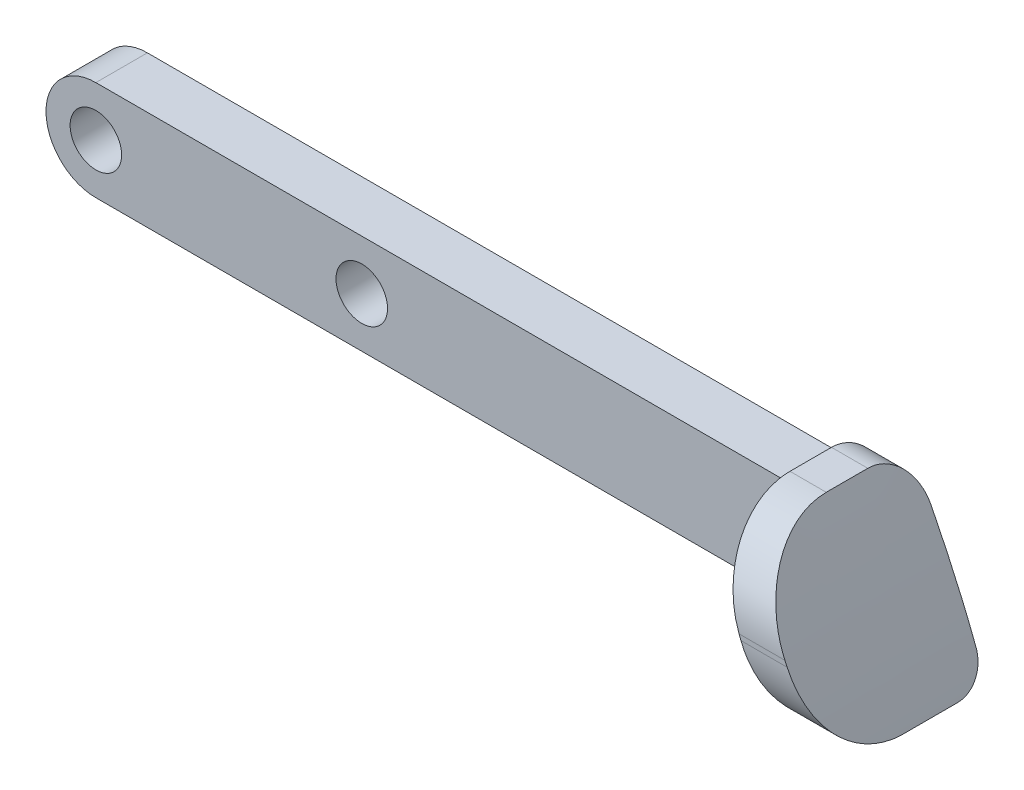
ISO-10303-21;
HEADER;
FILE_DESCRIPTION(('STEP AP214'),'2;1');
FILE_NAME('part.step','',(''),(''),'','','');
FILE_SCHEMA(('AUTOMOTIVE_DESIGN { 1 0 10303 214 1 1 1 1 }'));
ENDSEC;
DATA;
#1=APPLICATION_CONTEXT('core data for automotive mechanical design processes');
#2=APPLICATION_PROTOCOL_DEFINITION('international standard','automotive_design',2000,#1);
#3=PRODUCT_CONTEXT('',#1,'mechanical');
#4=PRODUCT('Part','Part','',(#3));
#5=PRODUCT_RELATED_PRODUCT_CATEGORY('part','',(#4));
#6=PRODUCT_DEFINITION_FORMATION('','',#4);
#7=PRODUCT_DEFINITION_CONTEXT('part definition',#1,'design');
#8=PRODUCT_DEFINITION('design','',#6,#7);
#9=PRODUCT_DEFINITION_SHAPE('','',#8);
#10=(LENGTH_UNIT() NAMED_UNIT(*) SI_UNIT(.MILLI.,.METRE.));
#11=(NAMED_UNIT(*) PLANE_ANGLE_UNIT() SI_UNIT($,.RADIAN.));
#12=(NAMED_UNIT(*) SI_UNIT($,.STERADIAN.) SOLID_ANGLE_UNIT());
#13=UNCERTAINTY_MEASURE_WITH_UNIT(LENGTH_MEASURE(1.E-05),#10,'distance_accuracy_value','');
#14=(GEOMETRIC_REPRESENTATION_CONTEXT(3) GLOBAL_UNCERTAINTY_ASSIGNED_CONTEXT((#13)) GLOBAL_UNIT_ASSIGNED_CONTEXT((#10,
#11,#12)) REPRESENTATION_CONTEXT('',''));
#15=CARTESIAN_POINT('',(0.,0.,0.));
#16=DIRECTION('',(0.,0.,1.));
#17=DIRECTION('',(1.,0.,0.));
#18=AXIS2_PLACEMENT_3D('',#15,#16,#17);
#19=CARTESIAN_POINT('',(0.,3.,3.1));
#20=DIRECTION('',(0.,1.,0.));
#21=DIRECTION('',(0.,0.,1.));
#22=AXIS2_PLACEMENT_3D('',#19,#20,#21);
#23=PLANE('',#22);
#24=DIRECTION('',(0.,0.,1.));
#25=VECTOR('',#24,1.);
#26=CARTESIAN_POINT('',(44.6395584776889,3.,3.1));
#27=LINE('',#26,#25);
#28=CARTESIAN_POINT('',(44.6395584776889,3.,0.));
#29=VERTEX_POINT('',#28);
#30=CARTESIAN_POINT('',(44.6395584776889,3.,3.1));
#31=VERTEX_POINT('',#30);
#32=EDGE_CURVE('E152',#29,#31,#27,.T.);
#33=ORIENTED_EDGE('',*,*,#32,.F.);
#34=DIRECTION('',(1.,0.,0.));
#35=VECTOR('',#34,1.);
#36=CARTESIAN_POINT('',(0.,3.,0.));
#37=LINE('',#36,#35);
#38=CARTESIAN_POINT('',(0.,3.,0.));
#39=VERTEX_POINT('',#38);
#40=EDGE_CURVE('E164',#39,#29,#37,.T.);
#41=ORIENTED_EDGE('',*,*,#40,.F.);
#42=DIRECTION('',(0.,0.,-1.));
#43=VECTOR('',#42,1.);
#44=CARTESIAN_POINT('',(0.,3.,3.1));
#45=LINE('',#44,#43);
#46=CARTESIAN_POINT('',(0.,3.,3.1));
#47=VERTEX_POINT('',#46);
#48=EDGE_CURVE('E169',#47,#39,#45,.T.);
#49=ORIENTED_EDGE('',*,*,#48,.F.);
#50=DIRECTION('',(1.,0.,0.));
#51=VECTOR('',#50,1.);
#52=CARTESIAN_POINT('',(0.,3.,3.1));
#53=LINE('',#52,#51);
#54=EDGE_CURVE('E285',#47,#31,#53,.T.);
#55=ORIENTED_EDGE('',*,*,#54,.T.);
#56=EDGE_LOOP('',(#33,#41,#49,#55));
#57=FACE_BOUND('',#56,.T.);
#58=ADVANCED_FACE('F38',(#57),#23,.T.);
#59=CARTESIAN_POINT('',(0.,0.,3.1));
#60=DIRECTION('',(0.,0.,-1.));
#61=DIRECTION('',(-1.,0.,0.));
#62=AXIS2_PLACEMENT_3D('',#59,#60,#61);
#63=CYLINDRICAL_SURFACE('',#62,3.);
#64=CARTESIAN_POINT('',(0.,0.,0.));
#65=DIRECTION('',(0.,0.,1.));
#66=DIRECTION('',(1.,0.,0.));
#67=AXIS2_PLACEMENT_3D('',#64,#65,#66);
#68=CIRCLE('',#67,3.);
#69=CARTESIAN_POINT('',(0.,-3.,0.));
#70=VERTEX_POINT('',#69);
#71=EDGE_CURVE('E159',#39,#70,#68,.T.);
#72=ORIENTED_EDGE('',*,*,#71,.T.);
#73=DIRECTION('',(0.,0.,-1.));
#74=VECTOR('',#73,1.);
#75=CARTESIAN_POINT('',(0.,-3.,3.1));
#76=LINE('',#75,#74);
#77=CARTESIAN_POINT('',(0.,-3.,3.1));
#78=VERTEX_POINT('',#77);
#79=EDGE_CURVE('E156',#78,#70,#76,.T.);
#80=ORIENTED_EDGE('',*,*,#79,.F.);
#81=CARTESIAN_POINT('',(0.,0.,3.1));
#82=DIRECTION('',(0.,0.,1.));
#83=DIRECTION('',(1.,0.,0.));
#84=AXIS2_PLACEMENT_3D('',#81,#82,#83);
#85=CIRCLE('',#84,3.);
#86=EDGE_CURVE('E288',#47,#78,#85,.T.);
#87=ORIENTED_EDGE('',*,*,#86,.F.);
#88=ORIENTED_EDGE('',*,*,#48,.T.);
#89=EDGE_LOOP('',(#72,#80,#87,#88));
#90=FACE_BOUND('',#89,.T.);
#91=ADVANCED_FACE('F310',(#90),#63,.T.);
#92=CARTESIAN_POINT('',(0.,-3.,3.1));
#93=DIRECTION('',(0.,1.,0.));
#94=DIRECTION('',(0.,0.,1.));
#95=AXIS2_PLACEMENT_3D('',#92,#93,#94);
#96=PLANE('',#95);
#97=DIRECTION('',(1.,0.,0.));
#98=VECTOR('',#97,1.);
#99=CARTESIAN_POINT('',(0.,-3.,0.));
#100=LINE('',#99,#98);
#101=CARTESIAN_POINT('',(46.9652062875649,-3.,0.));
#102=VERTEX_POINT('',#101);
#103=EDGE_CURVE('E138',#70,#102,#100,.T.);
#104=ORIENTED_EDGE('',*,*,#103,.T.);
#105=DIRECTION('',(0.,0.,1.));
#106=VECTOR('',#105,1.);
#107=CARTESIAN_POINT('',(46.9652062875649,-3.,3.1));
#108=LINE('',#107,#106);
#109=CARTESIAN_POINT('',(46.9652062875649,-3.,3.1));
#110=VERTEX_POINT('',#109);
#111=EDGE_CURVE('E146',#102,#110,#108,.T.);
#112=ORIENTED_EDGE('',*,*,#111,.T.);
#113=DIRECTION('',(1.,0.,0.));
#114=VECTOR('',#113,1.);
#115=CARTESIAN_POINT('',(0.,-3.,3.1));
#116=LINE('',#115,#114);
#117=EDGE_CURVE('E170',#78,#110,#116,.T.);
#118=ORIENTED_EDGE('',*,*,#117,.F.);
#119=ORIENTED_EDGE('',*,*,#79,.T.);
#120=EDGE_LOOP('',(#104,#112,#118,#119));
#121=FACE_BOUND('',#120,.T.);
#122=ADVANCED_FACE('F154',(#121),#96,.F.);
#123=CARTESIAN_POINT('',(0.,0.,3.1));
#124=DIRECTION('',(0.,0.,-1.));
#125=DIRECTION('',(-1.,0.,0.));
#126=AXIS2_PLACEMENT_3D('',#123,#124,#125);
#127=CYLINDRICAL_SURFACE('',#126,1.55);
#128=CARTESIAN_POINT('',(0.,0.,3.1));
#129=DIRECTION('',(0.,0.,1.));
#130=DIRECTION('',(1.,0.,0.));
#131=AXIS2_PLACEMENT_3D('',#128,#129,#130);
#132=CIRCLE('',#131,1.55);
#133=CARTESIAN_POINT('',(-1.55,0.,3.1));
#134=VERTEX_POINT('',#133);
#135=EDGE_CURVE('E162',#134,#134,#132,.T.);
#136=CARTESIAN_POINT('',(0.,0.,0.));
#137=DIRECTION('',(0.,0.,1.));
#138=DIRECTION('',(1.,0.,0.));
#139=AXIS2_PLACEMENT_3D('',#136,#137,#138);
#140=CIRCLE('',#139,1.55);
#141=CARTESIAN_POINT('',(-1.55,0.,0.));
#142=VERTEX_POINT('',#141);
#143=EDGE_CURVE('E294',#142,#142,#140,.T.);
#144=CARTESIAN_POINT('',(-1.55,0.,3.1));
#145=CARTESIAN_POINT('',(-1.55,0.,3.06770833333333));
#146=CARTESIAN_POINT('',(-1.55,0.,3.03541666666667));
#147=CARTESIAN_POINT('',(-1.55,0.,2.97083333333333));
#148=CARTESIAN_POINT('',(-1.55,0.,2.93854166666667));
#149=CARTESIAN_POINT('',(-1.55,0.,2.87395833333333));
#150=CARTESIAN_POINT('',(-1.55,0.,2.84166666666667));
#151=CARTESIAN_POINT('',(-1.55,0.,2.77708333333333));
#152=CARTESIAN_POINT('',(-1.55,0.,2.74479166666667));
#153=CARTESIAN_POINT('',(-1.55,0.,2.68020833333333));
#154=CARTESIAN_POINT('',(-1.55,0.,2.64791666666667));
#155=CARTESIAN_POINT('',(-1.55,0.,2.58333333333333));
#156=CARTESIAN_POINT('',(-1.55,0.,2.55104166666667));
#157=CARTESIAN_POINT('',(-1.55,0.,2.48645833333333));
#158=CARTESIAN_POINT('',(-1.55,0.,2.45416666666667));
#159=CARTESIAN_POINT('',(-1.55,0.,2.38958333333333));
#160=CARTESIAN_POINT('',(-1.55,0.,2.35729166666667));
#161=CARTESIAN_POINT('',(-1.55,0.,2.29270833333333));
#162=CARTESIAN_POINT('',(-1.55,0.,2.26041666666667));
#163=CARTESIAN_POINT('',(-1.55,0.,2.19583333333333));
#164=CARTESIAN_POINT('',(-1.55,0.,2.16354166666667));
#165=CARTESIAN_POINT('',(-1.55,0.,2.09895833333333));
#166=CARTESIAN_POINT('',(-1.55,0.,2.06666666666667));
#167=CARTESIAN_POINT('',(-1.55,0.,2.00208333333333));
#168=CARTESIAN_POINT('',(-1.55,0.,1.96979166666667));
#169=CARTESIAN_POINT('',(-1.55,0.,1.90520833333333));
#170=CARTESIAN_POINT('',(-1.55,0.,1.87291666666667));
#171=CARTESIAN_POINT('',(-1.55,0.,1.80833333333333));
#172=CARTESIAN_POINT('',(-1.55,0.,1.77604166666667));
#173=CARTESIAN_POINT('',(-1.55,0.,1.71145833333333));
#174=CARTESIAN_POINT('',(-1.55,0.,1.67916666666667));
#175=CARTESIAN_POINT('',(-1.55,0.,1.61458333333333));
#176=CARTESIAN_POINT('',(-1.55,0.,1.58229166666667));
#177=CARTESIAN_POINT('',(-1.55,0.,1.51770833333333));
#178=CARTESIAN_POINT('',(-1.55,0.,1.48541666666667));
#179=CARTESIAN_POINT('',(-1.55,0.,1.42083333333333));
#180=CARTESIAN_POINT('',(-1.55,0.,1.38854166666667));
#181=CARTESIAN_POINT('',(-1.55,0.,1.32395833333333));
#182=CARTESIAN_POINT('',(-1.55,0.,1.29166666666667));
#183=CARTESIAN_POINT('',(-1.55,0.,1.22708333333333));
#184=CARTESIAN_POINT('',(-1.55,0.,1.19479166666667));
#185=CARTESIAN_POINT('',(-1.55,0.,1.13020833333333));
#186=CARTESIAN_POINT('',(-1.55,0.,1.09791666666667));
#187=CARTESIAN_POINT('',(-1.55,0.,1.03333333333333));
#188=CARTESIAN_POINT('',(-1.55,0.,1.00104166666667));
#189=CARTESIAN_POINT('',(-1.55,0.,0.936458333333333));
#190=CARTESIAN_POINT('',(-1.55,0.,0.904166666666667));
#191=CARTESIAN_POINT('',(-1.55,0.,0.839583333333334));
#192=CARTESIAN_POINT('',(-1.55,0.,0.807291666666667));
#193=CARTESIAN_POINT('',(-1.55,0.,0.742708333333333));
#194=CARTESIAN_POINT('',(-1.55,0.,0.710416666666667));
#195=CARTESIAN_POINT('',(-1.55,0.,0.645833333333333));
#196=CARTESIAN_POINT('',(-1.55,0.,0.613541666666667));
#197=CARTESIAN_POINT('',(-1.55,0.,0.548958333333333));
#198=CARTESIAN_POINT('',(-1.55,0.,0.516666666666667));
#199=CARTESIAN_POINT('',(-1.55,0.,0.452083333333333));
#200=CARTESIAN_POINT('',(-1.55,0.,0.419791666666667));
#201=CARTESIAN_POINT('',(-1.55,0.,0.355208333333333));
#202=CARTESIAN_POINT('',(-1.55,0.,0.322916666666667));
#203=CARTESIAN_POINT('',(-1.55,0.,0.258333333333333));
#204=CARTESIAN_POINT('',(-1.55,0.,0.226041666666667));
#205=CARTESIAN_POINT('',(-1.55,0.,0.161458333333333));
#206=CARTESIAN_POINT('',(-1.55,0.,0.129166666666667));
#207=CARTESIAN_POINT('',(-1.55,0.,0.0645833333333335));
#208=CARTESIAN_POINT('',(-1.55,0.,0.0322916666666667));
#209=CARTESIAN_POINT('',(-1.55,0.,0.));
#210=B_SPLINE_CURVE_WITH_KNOTS('',3,(#144,#145,#146,#147,#148,#149,#150,#151,#152,#153,#154,
#155,#156,#157,#158,#159,#160,#161,#162,#163,#164,#165,#166,#167,#168,#169,#170,#171,#172,#173,
#174,#175,#176,#177,#178,#179,#180,#181,#182,#183,#184,#185,#186,#187,#188,#189,#190,#191,#192,
#193,#194,#195,#196,#197,#198,#199,#200,#201,#202,#203,#204,#205,#206,#207,#208,#209),
.UNSPECIFIED.,.F.,.F.,(4,2,2,2,2,2,2,2,2,2,2,2,2,2,2,2,2,2,2,2,2,2,2,2,2,2,2,2,2,2,2,2,4),(0.,
0.0968750000000002,0.19375,0.290625,0.3875,0.484375,0.58125,0.678125,0.775,0.871875,0.96875,
1.065625,1.1625,1.259375,1.35625,1.453125,1.55,1.646875,1.74375,1.840625,1.9375,2.034375,
2.13125,2.228125,2.325,2.421875,2.51875,2.615625,2.7125,2.809375,2.90625,3.003125,3.1),.UNSPECIFIED.);
#211=EDGE_CURVE('BSEAM299',#134,#142,#210,.T.);
#212=ORIENTED_EDGE('',*,*,#135,.T.);
#213=ORIENTED_EDGE('',*,*,#143,.F.);
#214=ORIENTED_EDGE('',*,*,#211,.T.);
#215=ORIENTED_EDGE('',*,*,#211,.F.);
#216=EDGE_LOOP('',(#212,#214,#213,#215));
#217=FACE_BOUND('',#216,.T.);
#218=ADVANCED_FACE('F299',(#217),#127,.F.);
#219=CARTESIAN_POINT('',(16.,0.,3.1));
#220=DIRECTION('',(0.,0.,-1.));
#221=DIRECTION('',(-1.,0.,0.));
#222=AXIS2_PLACEMENT_3D('',#219,#220,#221);
#223=CYLINDRICAL_SURFACE('',#222,1.55);
#224=CARTESIAN_POINT('',(16.,0.,3.1));
#225=DIRECTION('',(0.,0.,1.));
#226=DIRECTION('',(1.,0.,0.));
#227=AXIS2_PLACEMENT_3D('',#224,#225,#226);
#228=CIRCLE('',#227,1.55);
#229=CARTESIAN_POINT('',(14.45,0.,3.1));
#230=VERTEX_POINT('',#229);
#231=EDGE_CURVE('E158',#230,#230,#228,.T.);
#232=CARTESIAN_POINT('',(16.,0.,0.));
#233=DIRECTION('',(0.,0.,1.));
#234=DIRECTION('',(1.,0.,0.));
#235=AXIS2_PLACEMENT_3D('',#232,#233,#234);
#236=CIRCLE('',#235,1.55);
#237=CARTESIAN_POINT('',(14.45,0.,0.));
#238=VERTEX_POINT('',#237);
#239=EDGE_CURVE('E281',#238,#238,#236,.T.);
#240=CARTESIAN_POINT('',(14.45,0.,3.1));
#241=CARTESIAN_POINT('',(14.45,0.,3.06770833333333));
#242=CARTESIAN_POINT('',(14.45,0.,3.03541666666667));
#243=CARTESIAN_POINT('',(14.45,0.,2.97083333333333));
#244=CARTESIAN_POINT('',(14.45,0.,2.93854166666667));
#245=CARTESIAN_POINT('',(14.45,0.,2.87395833333333));
#246=CARTESIAN_POINT('',(14.45,0.,2.84166666666667));
#247=CARTESIAN_POINT('',(14.45,0.,2.77708333333333));
#248=CARTESIAN_POINT('',(14.45,0.,2.74479166666667));
#249=CARTESIAN_POINT('',(14.45,0.,2.68020833333333));
#250=CARTESIAN_POINT('',(14.45,0.,2.64791666666667));
#251=CARTESIAN_POINT('',(14.45,0.,2.58333333333333));
#252=CARTESIAN_POINT('',(14.45,0.,2.55104166666667));
#253=CARTESIAN_POINT('',(14.45,0.,2.48645833333333));
#254=CARTESIAN_POINT('',(14.45,0.,2.45416666666667));
#255=CARTESIAN_POINT('',(14.45,0.,2.38958333333333));
#256=CARTESIAN_POINT('',(14.45,0.,2.35729166666667));
#257=CARTESIAN_POINT('',(14.45,0.,2.29270833333333));
#258=CARTESIAN_POINT('',(14.45,0.,2.26041666666667));
#259=CARTESIAN_POINT('',(14.45,0.,2.19583333333333));
#260=CARTESIAN_POINT('',(14.45,0.,2.16354166666667));
#261=CARTESIAN_POINT('',(14.45,0.,2.09895833333333));
#262=CARTESIAN_POINT('',(14.45,0.,2.06666666666667));
#263=CARTESIAN_POINT('',(14.45,0.,2.00208333333333));
#264=CARTESIAN_POINT('',(14.45,0.,1.96979166666667));
#265=CARTESIAN_POINT('',(14.45,0.,1.90520833333333));
#266=CARTESIAN_POINT('',(14.45,0.,1.87291666666667));
#267=CARTESIAN_POINT('',(14.45,0.,1.80833333333333));
#268=CARTESIAN_POINT('',(14.45,0.,1.77604166666667));
#269=CARTESIAN_POINT('',(14.45,0.,1.71145833333333));
#270=CARTESIAN_POINT('',(14.45,0.,1.67916666666667));
#271=CARTESIAN_POINT('',(14.45,0.,1.61458333333333));
#272=CARTESIAN_POINT('',(14.45,0.,1.58229166666667));
#273=CARTESIAN_POINT('',(14.45,0.,1.51770833333333));
#274=CARTESIAN_POINT('',(14.45,0.,1.48541666666667));
#275=CARTESIAN_POINT('',(14.45,0.,1.42083333333333));
#276=CARTESIAN_POINT('',(14.45,0.,1.38854166666667));
#277=CARTESIAN_POINT('',(14.45,0.,1.32395833333333));
#278=CARTESIAN_POINT('',(14.45,0.,1.29166666666667));
#279=CARTESIAN_POINT('',(14.45,0.,1.22708333333333));
#280=CARTESIAN_POINT('',(14.45,0.,1.19479166666667));
#281=CARTESIAN_POINT('',(14.45,0.,1.13020833333333));
#282=CARTESIAN_POINT('',(14.45,0.,1.09791666666667));
#283=CARTESIAN_POINT('',(14.45,0.,1.03333333333333));
#284=CARTESIAN_POINT('',(14.45,0.,1.00104166666667));
#285=CARTESIAN_POINT('',(14.45,0.,0.936458333333333));
#286=CARTESIAN_POINT('',(14.45,0.,0.904166666666667));
#287=CARTESIAN_POINT('',(14.45,0.,0.839583333333334));
#288=CARTESIAN_POINT('',(14.45,0.,0.807291666666667));
#289=CARTESIAN_POINT('',(14.45,0.,0.742708333333333));
#290=CARTESIAN_POINT('',(14.45,0.,0.710416666666667));
#291=CARTESIAN_POINT('',(14.45,0.,0.645833333333333));
#292=CARTESIAN_POINT('',(14.45,0.,0.613541666666667));
#293=CARTESIAN_POINT('',(14.45,0.,0.548958333333333));
#294=CARTESIAN_POINT('',(14.45,0.,0.516666666666667));
#295=CARTESIAN_POINT('',(14.45,0.,0.452083333333333));
#296=CARTESIAN_POINT('',(14.45,0.,0.419791666666667));
#297=CARTESIAN_POINT('',(14.45,0.,0.355208333333333));
#298=CARTESIAN_POINT('',(14.45,0.,0.322916666666667));
#299=CARTESIAN_POINT('',(14.45,0.,0.258333333333333));
#300=CARTESIAN_POINT('',(14.45,0.,0.226041666666667));
#301=CARTESIAN_POINT('',(14.45,0.,0.161458333333333));
#302=CARTESIAN_POINT('',(14.45,0.,0.129166666666667));
#303=CARTESIAN_POINT('',(14.45,0.,0.0645833333333335));
#304=CARTESIAN_POINT('',(14.45,0.,0.0322916666666667));
#305=CARTESIAN_POINT('',(14.45,0.,0.));
#306=B_SPLINE_CURVE_WITH_KNOTS('',3,(#240,#241,#242,#243,#244,#245,#246,#247,#248,#249,#250,
#251,#252,#253,#254,#255,#256,#257,#258,#259,#260,#261,#262,#263,#264,#265,#266,#267,#268,#269,
#270,#271,#272,#273,#274,#275,#276,#277,#278,#279,#280,#281,#282,#283,#284,#285,#286,#287,#288,
#289,#290,#291,#292,#293,#294,#295,#296,#297,#298,#299,#300,#301,#302,#303,#304,#305),
.UNSPECIFIED.,.F.,.F.,(4,2,2,2,2,2,2,2,2,2,2,2,2,2,2,2,2,2,2,2,2,2,2,2,2,2,2,2,2,2,2,2,4),(0.,
0.0968750000000002,0.19375,0.290625,0.3875,0.484375,0.58125,0.678125,0.775,0.871875,0.96875,
1.065625,1.1625,1.259375,1.35625,1.453125,1.55,1.646875,1.74375,1.840625,1.9375,2.034375,
2.13125,2.228125,2.325,2.421875,2.51875,2.615625,2.7125,2.809375,2.90625,3.003125,3.1),.UNSPECIFIED.);
#307=EDGE_CURVE('BSEAM301',#230,#238,#306,.T.);
#308=ORIENTED_EDGE('',*,*,#231,.T.);
#309=ORIENTED_EDGE('',*,*,#239,.F.);
#310=ORIENTED_EDGE('',*,*,#307,.T.);
#311=ORIENTED_EDGE('',*,*,#307,.F.);
#312=EDGE_LOOP('',(#308,#310,#309,#311));
#313=FACE_BOUND('',#312,.T.);
#314=ADVANCED_FACE('F301',(#313),#223,.F.);
#315=CARTESIAN_POINT('',(0.,0.,3.1));
#316=DIRECTION('',(0.,0.,1.));
#317=DIRECTION('',(1.,0.,0.));
#318=AXIS2_PLACEMENT_3D('',#315,#316,#317);
#319=PLANE('',#318);
#320=DIRECTION('',(0.361408593812913,-0.932407544112645,0.));
#321=VECTOR('',#320,1.);
#322=CARTESIAN_POINT('',(39.819850541901,15.4344913670606,3.1));
#323=LINE('',#322,#321);
#324=EDGE_CURVE('E149',#31,#110,#323,.T.);
#325=ORIENTED_EDGE('',*,*,#324,.F.);
#326=ORIENTED_EDGE('',*,*,#54,.F.);
#327=ORIENTED_EDGE('',*,*,#86,.T.);
#328=ORIENTED_EDGE('',*,*,#117,.T.);
#329=EDGE_LOOP('',(#325,#326,#327,#328));
#330=FACE_BOUND('',#329,.T.);
#331=ORIENTED_EDGE('',*,*,#231,.F.);
#332=EDGE_LOOP('',(#331));
#333=FACE_BOUND('',#332,.T.);
#334=ORIENTED_EDGE('',*,*,#135,.F.);
#335=EDGE_LOOP('',(#334));
#336=FACE_BOUND('',#335,.T.);
#337=ADVANCED_FACE('F308',(#330,#333,#336),#319,.T.);
#338=CARTESIAN_POINT('',(0.,0.,0.));
#339=DIRECTION('',(0.,0.,1.));
#340=DIRECTION('',(1.,0.,0.));
#341=AXIS2_PLACEMENT_3D('',#338,#339,#340);
#342=PLANE('',#341);
#343=ORIENTED_EDGE('',*,*,#239,.T.);
#344=EDGE_LOOP('',(#343));
#345=FACE_BOUND('',#344,.T.);
#346=ORIENTED_EDGE('',*,*,#143,.T.);
#347=EDGE_LOOP('',(#346));
#348=FACE_BOUND('',#347,.T.);
#349=CARTESIAN_POINT('',(45.8446255617211,5.52517801406493,0.));
#350=CARTESIAN_POINT('',(47.6225170615618,2.2123782727855,0.));
#351=CARTESIAN_POINT('',(49.2890510500116,-1.18916518240475,0.));
#352=CARTESIAN_POINT('',(50.4632290338258,-4.76886794904122,0.));
#353=B_SPLINE_CURVE_WITH_KNOTS('',3,(#349,#350,#351,#352),.UNSPECIFIED.,.F.,.F.,(4,4),(0.,1.),.UNSPECIFIED.);
#354=CARTESIAN_POINT('',(47.1498799686748,3.02517801406503,0.));
#355=VERTEX_POINT('',#354);
#356=CARTESIAN_POINT('',(49.8652239145846,-3.06886794904115,0.));
#357=VERTEX_POINT('',#356);
#358=EDGE_CURVE('E239',#355,#357,#353,.T.);
#359=ORIENTED_EDGE('',*,*,#358,.T.);
#360=DIRECTION('',(-1.,0.,0.));
#361=VECTOR('',#360,1.);
#362=CARTESIAN_POINT('',(47.6508335995062,-3.06886794904122,0.));
#363=LINE('',#362,#361);
#364=CARTESIAN_POINT('',(46.9919000533746,-3.06886794904122,0.));
#365=VERTEX_POINT('',#364);
#366=EDGE_CURVE('E141',#357,#365,#363,.T.);
#367=ORIENTED_EDGE('',*,*,#366,.T.);
#368=DIRECTION('',(-0.361408593812913,0.932407544112644,0.));
#369=VECTOR('',#368,1.);
#370=CARTESIAN_POINT('',(43.6607793580293,5.52517801406493,0.));
#371=LINE('',#370,#369);
#372=EDGE_CURVE('E132',#365,#102,#371,.T.);
#373=ORIENTED_EDGE('',*,*,#372,.T.);
#374=ORIENTED_EDGE('',*,*,#103,.F.);
#375=ORIENTED_EDGE('',*,*,#71,.F.);
#376=ORIENTED_EDGE('',*,*,#40,.T.);
#377=CARTESIAN_POINT('',(44.629799278811,3.02517801406493,0.));
#378=VERTEX_POINT('',#377);
#379=EDGE_CURVE('E143',#29,#378,#371,.T.);
#380=ORIENTED_EDGE('',*,*,#379,.T.);
#381=DIRECTION('',(1.,0.,0.));
#382=VECTOR('',#381,1.);
#383=CARTESIAN_POINT('',(45.8446255617211,3.02517801406493,0.));
#384=LINE('',#383,#382);
#385=EDGE_CURVE('E222',#378,#355,#384,.T.);
#386=ORIENTED_EDGE('',*,*,#385,.T.);
#387=EDGE_LOOP('',(#359,#367,#373,#374,#375,#376,#380,#386));
#388=FACE_BOUND('',#387,.T.);
#389=ADVANCED_FACE('F135',(#345,#348,#388),#342,.F.);
#390=CARTESIAN_POINT('',(45.8446255617211,5.52517801406493,10.));
#391=CARTESIAN_POINT('',(47.6225170615618,2.2123782727855,10.));
#392=CARTESIAN_POINT('',(49.2890510500116,-1.18916518240475,10.));
#393=CARTESIAN_POINT('',(50.4632290338258,-4.76886794904122,10.));
#394=B_SPLINE_CURVE_WITH_KNOTS('',3,(#390,#391,#392,#393),.UNSPECIFIED.,.F.,.F.,(4,4),(0.,1.),.UNSPECIFIED.);
#395=DIRECTION('',(0.,0.,-1.));
#396=VECTOR('',#395,1.);
#397=SURFACE_OF_LINEAR_EXTRUSION('',#394,#396);
#398=DIRECTION('',(0.,0.,-1.));
#399=VECTOR('',#398,1.);
#400=CARTESIAN_POINT('',(50.4632290338258,-4.76886794904122,10.));
#401=LINE('',#400,#399);
#402=CARTESIAN_POINT('',(50.4632290338258,-4.76886794904122,5.));
#403=VERTEX_POINT('',#402);
#404=CARTESIAN_POINT('',(50.4632290338258,-4.76886794904122,1.7));
#405=VERTEX_POINT('',#404);
#406=EDGE_CURVE('E249',#403,#405,#401,.T.);
#407=ORIENTED_EDGE('',*,*,#406,.T.);
#408=CARTESIAN_POINT('',(50.4632290338258,-4.76886794904122,1.7));
#409=CARTESIAN_POINT('',(50.4632288275113,-4.76886881291591,1.65396280781216));
#410=CARTESIAN_POINT('',(50.462615261702,-4.7669965906476,1.60794822850901));
#411=CARTESIAN_POINT('',(50.4601669211131,-4.75953542129718,1.51626036786668));
#412=CARTESIAN_POINT('',(50.4583323128456,-4.7539469809919,1.47058704084994));
#413=CARTESIAN_POINT('',(50.4510190873418,-4.73169378399643,1.3347668805819));
#414=CARTESIAN_POINT('',(50.4437309849388,-4.70954075615502,1.24554980687492));
#415=CARTESIAN_POINT('',(50.4245116341149,-4.65139622128836,1.07233430125503));
#416=CARTESIAN_POINT('',(50.4125801421456,-4.61540398839006,0.988336143345276));
#417=CARTESIAN_POINT('',(50.3843691499736,-4.53083827868573,0.827716437420604));
#418=CARTESIAN_POINT('',(50.3680888913417,-4.48226260736028,0.751096179292848));
#419=CARTESIAN_POINT('',(50.3312241247233,-4.37309984157523,0.605742303294429));
#420=CARTESIAN_POINT('',(50.310563139202,-4.31230048286911,0.537187876161133));
#421=CARTESIAN_POINT('',(50.2656310874652,-4.18122936598254,0.411234088567967));
#422=CARTESIAN_POINT('',(50.2413592776372,-4.11095565693614,0.353837031484482));
#423=CARTESIAN_POINT('',(50.1885380633042,-3.95945683591496,0.248882227245521));
#424=CARTESIAN_POINT('',(50.159840079302,-3.87786974700001,0.201922568755123));
#425=CARTESIAN_POINT('',(50.0997855720478,-3.70888123623591,0.122308375443313));
#426=CARTESIAN_POINT('',(50.0684282312031,-3.62147802807058,0.0896582591153266));
#427=CARTESIAN_POINT('',(50.0086756939818,-3.45664161082048,0.0429464524770611));
#428=CARTESIAN_POINT('',(49.9805441855383,-3.37968570185936,0.0268277677124445));
#429=CARTESIAN_POINT('',(49.9234227815111,-3.22474790056903,0.00535495360180084));
#430=CARTESIAN_POINT('',(49.8944344213794,-3.14676796792356,-1.73715752164224E-05));
#431=CARTESIAN_POINT('',(49.8652239145846,-3.06886794904115,0.));
#432=B_SPLINE_CURVE_WITH_KNOTS('',3,(#408,#409,#410,#411,#412,#413,#414,#415,#416,#417,#418,
#419,#420,#421,#422,#423,#424,#425,#426,#427,#428,#429,#430,#431),.UNSPECIFIED.,.F.,.F.,(4,2,2,
2,2,2,2,2,2,2,2,4),(0.,0.138024814819728,0.27603081119665,0.551243162982783,0.826469951760336,
1.10174477173662,1.38229271225856,1.66289850896079,1.95685544884689,2.25090309277279,
2.50073113452958,2.75013580595558),.UNSPECIFIED.);
#433=EDGE_CURVE('E11',#405,#357,#432,.T.);
#434=ORIENTED_EDGE('',*,*,#433,.T.);
#435=ORIENTED_EDGE('',*,*,#358,.F.);
#436=CARTESIAN_POINT('',(47.1498799686747,3.02517801406493,0.));
#437=CARTESIAN_POINT('',(47.0714822798714,3.18042498483698,-2.74764117618217E-05));
#438=CARTESIAN_POINT('',(46.9925885682587,3.33547452504738,0.0144630732755245));
#439=CARTESIAN_POINT('',(46.8359585984083,3.64135389254784,0.0721217237579438));
#440=CARTESIAN_POINT('',(46.7582265972328,3.79216942968226,0.115377032752658));
#441=CARTESIAN_POINT('',(46.6064693375411,4.08496414661408,0.230282645962123));
#442=CARTESIAN_POINT('',(46.5324494607051,4.22693056581575,0.301972905689635));
#443=CARTESIAN_POINT('',(46.391062423182,4.49685612196524,0.472773429717924));
#444=CARTESIAN_POINT('',(46.3236878560492,4.62483087081766,0.571852688500329));
#445=CARTESIAN_POINT('',(46.2023325112556,4.85450780075351,0.789166274447955));
#446=CARTESIAN_POINT('',(46.1477883781618,4.95733030953245,0.905881208157153));
#447=CARTESIAN_POINT('',(46.0745011360641,5.09514045902349,1.09593020796981));
#448=CARTESIAN_POINT('',(46.0514854780529,5.13835497104457,1.16180756792905));
#449=CARTESIAN_POINT('',(46.0086181907068,5.21875447845802,1.29813830421373));
#450=CARTESIAN_POINT('',(45.9887659478706,5.25594064299076,1.36859078951629));
#451=CARTESIAN_POINT('',(45.9547670875005,5.31956934014822,1.50465703754549));
#452=CARTESIAN_POINT('',(45.940220317233,5.3467682397269,1.56981890413932));
#453=CARTESIAN_POINT('',(45.9140351720694,5.39569804230047,1.70272592528889));
#454=CARTESIAN_POINT('',(45.9023962947022,5.4174298899825,1.77047063120626));
#455=CARTESIAN_POINT('',(45.8822237618985,5.45507891169791,1.90784761764563));
#456=CARTESIAN_POINT('',(45.8736834922397,5.47100847146055,1.97747553258287));
#457=CARTESIAN_POINT('',(45.859813656103,5.49687187230107,2.1181160357354));
#458=CARTESIAN_POINT('',(45.8544819416248,5.50680972459732,2.18912766465744));
#459=CARTESIAN_POINT('',(45.8487408032335,5.51750955022813,2.30029130010409));
#460=CARTESIAN_POINT('',(45.8471972543524,5.52038594596278,2.34019504560636));
#461=CARTESIAN_POINT('',(45.8451401385236,5.52421919309211,2.42006380239128));
#462=CARTESIAN_POINT('',(45.8446251013843,5.52517878443622,2.46002864438367));
#463=CARTESIAN_POINT('',(45.8446255617211,5.52517801406493,2.5));
#464=B_SPLINE_CURVE_WITH_KNOTS('',3,(#436,#437,#438,#439,#440,#441,#442,#443,#444,#445,#446,
#447,#448,#449,#450,#451,#452,#453,#454,#455,#456,#457,#458,#459,#460,#461,#462,#463),
.UNSPECIFIED.,.F.,.F.,(4,2,2,2,2,2,2,2,2,2,2,2,2,4),(0.,0.521245705702186,1.0440789585235,
1.56764949065575,2.09062972877987,2.58200565737025,2.82790545956814,3.07375751464917,
3.28974327544293,3.50569168898992,3.72117639334369,3.93651667830635,4.05657479071794,
4.17646116456472),.UNSPECIFIED.);
#465=CARTESIAN_POINT('',(45.8446255617211,5.52517801406493,2.5));
#466=VERTEX_POINT('',#465);
#467=EDGE_CURVE('E214',#355,#466,#464,.T.);
#468=ORIENTED_EDGE('',*,*,#467,.T.);
#469=DIRECTION('',(0.,0.,-1.));
#470=VECTOR('',#469,1.);
#471=CARTESIAN_POINT('',(45.8446255617211,5.52517801406493,10.));
#472=LINE('',#471,#470);
#473=CARTESIAN_POINT('',(45.8446255617211,5.52517801406493,5.));
#474=VERTEX_POINT('',#473);
#475=EDGE_CURVE('E276',#474,#466,#472,.T.);
#476=ORIENTED_EDGE('',*,*,#475,.F.);
#477=CARTESIAN_POINT('',(45.8446255617211,5.52517801406493,5.));
#478=CARTESIAN_POINT('',(45.844612055669,5.52520032541012,5.12894689257132));
#479=CARTESIAN_POINT('',(45.8473020135973,5.52019080682159,5.25788474204632));
#480=CARTESIAN_POINT('',(45.8579889588883,5.50027365409044,5.51473280770917));
#481=CARTESIAN_POINT('',(45.8659842744154,5.48536913807972,5.64264333478168));
#482=CARTESIAN_POINT('',(45.8871396337001,5.44590665570231,5.89600045705318));
#483=CARTESIAN_POINT('',(45.9002788301121,5.42138765470114,6.02145487806531));
#484=CARTESIAN_POINT('',(45.9315377979842,5.36299985537038,6.26953423333331));
#485=CARTESIAN_POINT('',(45.9496577714741,5.32913067777954,6.3921590525964));
#486=CARTESIAN_POINT('',(45.9906216030089,5.25246849655112,6.63363078077556));
#487=CARTESIAN_POINT('',(46.0134604433272,5.20968497142849,6.75248154914413));
#488=CARTESIAN_POINT('',(46.0635873879391,5.1156399591089,6.98582714292488));
#489=CARTESIAN_POINT('',(46.0908771618346,5.06437529042319,7.10032031379271));
#490=CARTESIAN_POINT('',(46.1789787559354,4.89857350179391,7.43632741453544));
#491=CARTESIAN_POINT('',(46.246033471092,4.77200879609154,7.65043046965443));
#492=CARTESIAN_POINT('',(46.3975372056785,4.48456421811713,8.06430140035973));
#493=CARTESIAN_POINT('',(46.482681503546,4.32229877430508,8.26283982377646));
#494=CARTESIAN_POINT('',(46.6648146416682,3.97276468436136,8.630215686075));
#495=CARTESIAN_POINT('',(46.7618073262775,3.78548792115139,8.79904344136953));
#496=CARTESIAN_POINT('',(46.9760163522791,3.36830511332541,9.12237458298746));
#497=CARTESIAN_POINT('',(47.0942778141278,3.13597317527722,9.27305484517216));
#498=CARTESIAN_POINT('',(47.337506572345,2.65247231201106,9.53322180226189));
#499=CARTESIAN_POINT('',(47.4624779514197,2.40129188045373,9.64268308501774));
#500=CARTESIAN_POINT('',(47.7166820015217,1.88315234438987,9.81991060189795));
#501=CARTESIAN_POINT('',(47.8459447250183,1.61606095702039,9.88725051223936));
#502=CARTESIAN_POINT('',(48.0392534191688,1.21004541459007,9.95477592650196));
#503=CARTESIAN_POINT('',(48.1035776897444,1.07384171555597,9.97170361097202));
#504=CARTESIAN_POINT('',(48.2316741035906,0.800245289498363,9.99431200598105));
#505=CARTESIAN_POINT('',(48.295446240788,0.662852549429205,9.99999259296406));
#506=CARTESIAN_POINT('',(48.3587581904946,0.525178014065096,10.));
#507=B_SPLINE_CURVE_WITH_KNOTS('',3,(#477,#478,#479,#480,#481,#482,#483,#484,#485,#486,#487,
#488,#489,#490,#491,#492,#493,#494,#495,#496,#497,#498,#499,#500,#501,#502,#503,#504,#505,#506),
.UNSPECIFIED.,.F.,.F.,(4,2,2,2,2,2,2,2,2,2,2,2,2,2,4),(0.,0.386701247288153,0.773280694289821,
1.15830934999344,1.5433536254987,1.9279905586154,2.31277210718464,3.08214097274196,
3.88949076485224,4.69710321079233,5.59672322437804,6.49689696331696,7.40604017413921,
7.86040752386931,8.31477986506312),.UNSPECIFIED.);
#508=CARTESIAN_POINT('',(48.3587581904946,0.525178014065088,10.));
#509=VERTEX_POINT('',#508);
#510=EDGE_CURVE('E183',#474,#509,#507,.T.);
#511=ORIENTED_EDGE('',*,*,#510,.T.);
#512=CARTESIAN_POINT('',(48.4930884409794,0.231132050959114,10.));
#513=VERTEX_POINT('',#512);
#514=EDGE_CURVE('E142',#509,#513,#394,.T.);
#515=ORIENTED_EDGE('',*,*,#514,.T.);
#516=CARTESIAN_POINT('',(48.4930884409791,0.231132050958781,10.));
#517=CARTESIAN_POINT('',(48.5596761804852,0.0844007288168149,10.0000069779001));
#518=CARTESIAN_POINT('',(48.6256932600272,-0.0626064181320284,9.99354081425444));
#519=CARTESIAN_POINT('',(48.7561396735039,-0.356225784137563,9.96756702051866));
#520=CARTESIAN_POINT('',(48.820568498141,-0.502837863424689,9.94805526214704));
#521=CARTESIAN_POINT('',(48.9475354432491,-0.795054942855532,9.89581835870529));
#522=CARTESIAN_POINT('',(49.0100674533572,-0.940655719216084,9.86305456496875));
#523=CARTESIAN_POINT('',(49.1325863612974,-1.22931638755786,9.78429390715526));
#524=CARTESIAN_POINT('',(49.1925735152128,-1.37237653435072,9.73829837820026));
#525=CARTESIAN_POINT('',(49.3097281259377,-1.6551832642757,9.63299445044576));
#526=CARTESIAN_POINT('',(49.3668881205666,-1.79492062026427,9.57365289754996));
#527=CARTESIAN_POINT('',(49.4778198533986,-2.06948666861618,9.44188450609099));
#528=CARTESIAN_POINT('',(49.5315917504777,-2.20431559102236,9.36945828171625));
#529=CARTESIAN_POINT('',(49.6353074075545,-2.46762165232322,9.21191553567224));
#530=CARTESIAN_POINT('',(49.6852563844632,-2.59610735919521,9.12681679237507));
#531=CARTESIAN_POINT('',(49.7810767542162,-2.84562712160713,8.94429222287648));
#532=CARTESIAN_POINT('',(49.826948484538,-2.96666179362051,8.8468674185349));
#533=CARTESIAN_POINT('',(49.9115017678737,-3.19242660988634,8.64698288652698));
#534=CARTESIAN_POINT('',(49.9504565561542,-3.29770502253179,8.54525750804966));
#535=CARTESIAN_POINT('',(50.0243581057138,-3.49956503500845,8.33218124401082));
#536=CARTESIAN_POINT('',(50.0593051901517,-3.59614733591012,8.22083113580502));
#537=CARTESIAN_POINT('',(50.1250446307716,-3.77964147065492,7.98923541822149));
#538=CARTESIAN_POINT('',(50.155835960489,-3.86655091439185,7.86898762244331));
#539=CARTESIAN_POINT('',(50.2131312801512,-4.02973141755922,7.62052069010088));
#540=CARTESIAN_POINT('',(50.2396356151681,-4.10600333316536,7.49230219627126));
#541=CARTESIAN_POINT('',(50.2865779439868,-4.24215847553799,7.23807862685347));
#542=CARTESIAN_POINT('',(50.3073096661881,-4.30281264440841,7.11253996606943));
#543=CARTESIAN_POINT('',(50.3449378085286,-4.41358908006881,6.85635076659207));
#544=CARTESIAN_POINT('',(50.3618345229326,-4.46371215490066,6.72570062101177));
#545=CARTESIAN_POINT('',(50.3917441291674,-4.55287836161986,6.46041223772643));
#546=CARTESIAN_POINT('',(50.4047615261213,-4.59193434331516,6.32577882726947));
#547=CARTESIAN_POINT('',(50.4269152904088,-4.65864043815421,6.05345651786395));
#548=CARTESIAN_POINT('',(50.4360532321717,-4.68629517822037,5.91576888235336));
#549=CARTESIAN_POINT('',(50.4499127692377,-4.728323814497,5.64861254571213));
#550=CARTESIAN_POINT('',(50.4549107379208,-4.74352786562429,5.51928804884119));
#551=CARTESIAN_POINT('',(50.4615662687789,-4.76379907331095,5.25997724148349));
#552=CARTESIAN_POINT('',(50.4632293339671,-4.76888292937344,5.12999237669643));
#553=CARTESIAN_POINT('',(50.4632290338258,-4.76886794904122,5.));
#554=B_SPLINE_CURVE_WITH_KNOTS('',3,(#516,#517,#518,#519,#520,#521,#522,#523,#524,#525,#526,
#527,#528,#529,#530,#531,#532,#533,#534,#535,#536,#537,#538,#539,#540,#541,#542,#543,#544,#545,
#546,#547,#548,#549,#550,#551,#552,#553),.UNSPECIFIED.,.F.,.F.,(4,2,2,2,2,2,2,2,2,2,2,2,2,2,2,2,
2,2,4),(0.,0.48329299092671,0.96673899246441,1.45160521658183,1.93642253338684,2.42245780044711,
2.90847025916163,3.39380720111833,3.87910393381828,4.33298104852331,4.78682153935593,
5.24077392370179,5.69468974997018,6.11703168544179,6.5393412031331,6.96115835647857,
7.38280415646802,7.77330276440966,8.16315646815633),.UNSPECIFIED.);
#555=EDGE_CURVE('E190',#513,#403,#554,.T.);
#556=ORIENTED_EDGE('',*,*,#555,.T.);
#557=EDGE_LOOP('',(#407,#434,#435,#468,#476,#511,#515,#556));
#558=FACE_BOUND('',#557,.T.);
#559=ADVANCED_FACE('F197',(#558),#397,.T.);
#560=CARTESIAN_POINT('',(45.8446255617211,5.52517801406493,10.));
#561=DIRECTION('',(0.,1.,0.));
#562=DIRECTION('',(-1.,0.,0.));
#563=AXIS2_PLACEMENT_3D('',#560,#561,#562);
#564=PLANE('',#563);
#565=ORIENTED_EDGE('',*,*,#475,.T.);
#566=DIRECTION('',(1.,0.,0.));
#567=VECTOR('',#566,1.);
#568=CARTESIAN_POINT('',(43.6607793580293,5.52517801406493,2.5));
#569=LINE('',#568,#567);
#570=CARTESIAN_POINT('',(43.6607793580293,5.52517801406493,2.5));
#571=VERTEX_POINT('',#570);
#572=EDGE_CURVE('E221',#466,#571,#569,.F.);
#573=ORIENTED_EDGE('',*,*,#572,.T.);
#574=DIRECTION('',(0.,0.,-1.));
#575=VECTOR('',#574,1.);
#576=CARTESIAN_POINT('',(43.6607793580293,5.52517801406493,10.));
#577=LINE('',#576,#575);
#578=CARTESIAN_POINT('',(43.6607793580293,5.52517801406493,5.));
#579=VERTEX_POINT('',#578);
#580=EDGE_CURVE('E232',#579,#571,#577,.T.);
#581=ORIENTED_EDGE('',*,*,#580,.F.);
#582=DIRECTION('',(1.,0.,0.));
#583=VECTOR('',#582,1.);
#584=CARTESIAN_POINT('',(45.8446255617211,5.52517801406493,5.));
#585=LINE('',#584,#583);
#586=EDGE_CURVE('E240',#579,#474,#585,.T.);
#587=ORIENTED_EDGE('',*,*,#586,.T.);
#588=EDGE_LOOP('',(#565,#573,#581,#587));
#589=FACE_BOUND('',#588,.T.);
#590=ADVANCED_FACE('F350',(#589),#564,.T.);
#591=CARTESIAN_POINT('',(43.6607793580293,5.52517801406493,10.));
#592=DIRECTION('',(-0.932407544112645,-0.361408593812913,0.));
#593=DIRECTION('',(0.361408593812913,-0.932407544112645,0.));
#594=AXIS2_PLACEMENT_3D('',#591,#592,#593);
#595=PLANE('',#594);
#596=ORIENTED_EDGE('',*,*,#372,.F.);
#597=CARTESIAN_POINT('',(46.9919000533746,-3.06886794904122,1.7));
#598=DIRECTION('',(-0.932407544112645,-0.361408593812913,0.));
#599=DIRECTION('',(0.361408593812913,-0.932407544112645,0.));
#600=AXIS2_PLACEMENT_3D('',#597,#598,#599);
#601=ELLIPSE('',#600,1.82323707131505,1.7);
#602=CARTESIAN_POINT('',(47.6508335995062,-4.76886794904122,1.7));
#603=VERTEX_POINT('',#602);
#604=EDGE_CURVE('E66',#365,#603,#601,.T.);
#605=ORIENTED_EDGE('',*,*,#604,.T.);
#606=DIRECTION('',(0.,0.,-1.));
#607=VECTOR('',#606,1.);
#608=CARTESIAN_POINT('',(47.6508335995062,-4.76886794904122,10.));
#609=LINE('',#608,#607);
#610=CARTESIAN_POINT('',(47.6508335995062,-4.76886794904122,5.));
#611=VERTEX_POINT('',#610);
#612=EDGE_CURVE('E256',#611,#603,#609,.T.);
#613=ORIENTED_EDGE('',*,*,#612,.F.);
#614=CARTESIAN_POINT('',(45.7127937579428,0.231132050958781,5.));
#615=DIRECTION('',(-0.932407544112645,-0.361408593812913,0.));
#616=DIRECTION('',(-0.361408593812913,0.932407544112645,0.));
#617=AXIS2_PLACEMENT_3D('',#614,#615,#616);
#618=ELLIPSE('',#617,5.36246197445604,5.);
#619=CARTESIAN_POINT('',(45.7127937579428,0.231132050958783,10.));
#620=VERTEX_POINT('',#619);
#621=EDGE_CURVE('E177',#611,#620,#618,.T.);
#622=ORIENTED_EDGE('',*,*,#621,.T.);
#623=DIRECTION('',(-0.361408593812913,0.932407544112644,0.));
#624=VECTOR('',#623,1.);
#625=CARTESIAN_POINT('',(43.6607793580293,5.52517801406493,10.));
#626=LINE('',#625,#624);
#627=CARTESIAN_POINT('',(45.5988191995927,0.525178014064934,10.));
#628=VERTEX_POINT('',#627);
#629=EDGE_CURVE('E257',#620,#628,#626,.T.);
#630=ORIENTED_EDGE('',*,*,#629,.T.);
#631=CARTESIAN_POINT('',(45.5988191995927,0.525178014064933,5.));
#632=DIRECTION('',(-0.932407544112645,-0.361408593812913,0.));
#633=DIRECTION('',(0.361408593812913,-0.932407544112645,0.));
#634=AXIS2_PLACEMENT_3D('',#631,#632,#633);
#635=ELLIPSE('',#634,5.36246197445604,5.);
#636=EDGE_CURVE('E175',#628,#579,#635,.T.);
#637=ORIENTED_EDGE('',*,*,#636,.T.);
#638=ORIENTED_EDGE('',*,*,#580,.T.);
#639=CARTESIAN_POINT('',(44.629799278811,3.02517801406493,2.5));
#640=DIRECTION('',(-0.932407544112645,-0.361408593812913,0.));
#641=DIRECTION('',(-0.361408593812913,0.932407544112645,0.));
#642=AXIS2_PLACEMENT_3D('',#639,#640,#641);
#643=ELLIPSE('',#642,2.68123098722802,2.5);
#644=EDGE_CURVE('E224',#571,#378,#643,.T.);
#645=ORIENTED_EDGE('',*,*,#644,.T.);
#646=ORIENTED_EDGE('',*,*,#379,.F.);
#647=ORIENTED_EDGE('',*,*,#32,.T.);
#648=ORIENTED_EDGE('',*,*,#324,.T.);
#649=ORIENTED_EDGE('',*,*,#111,.F.);
#650=EDGE_LOOP('',(#596,#605,#613,#622,#630,#637,#638,#645,#646,#647,#648,#649));
#651=FACE_BOUND('',#650,.T.);
#652=ADVANCED_FACE('F147',(#651),#595,.T.);
#653=CARTESIAN_POINT('',(47.6508335995062,-4.76886794904122,10.));
#654=DIRECTION('',(0.,-1.,0.));
#655=DIRECTION('',(0.,0.,-1.));
#656=AXIS2_PLACEMENT_3D('',#653,#654,#655);
#657=PLANE('',#656);
#658=ORIENTED_EDGE('',*,*,#612,.T.);
#659=DIRECTION('',(-1.,0.,0.));
#660=VECTOR('',#659,1.);
#661=CARTESIAN_POINT('',(50.4632290338258,-4.76886794904122,1.7));
#662=LINE('',#661,#660);
#663=EDGE_CURVE('E52',#603,#405,#662,.F.);
#664=ORIENTED_EDGE('',*,*,#663,.T.);
#665=ORIENTED_EDGE('',*,*,#406,.F.);
#666=DIRECTION('',(-1.,0.,0.));
#667=VECTOR('',#666,1.);
#668=CARTESIAN_POINT('',(47.6508335995062,-4.76886794904122,5.));
#669=LINE('',#668,#667);
#670=EDGE_CURVE('E172',#403,#611,#669,.T.);
#671=ORIENTED_EDGE('',*,*,#670,.T.);
#672=EDGE_LOOP('',(#658,#664,#665,#671));
#673=FACE_BOUND('',#672,.T.);
#674=ADVANCED_FACE('F255',(#673),#657,.T.);
#675=CARTESIAN_POINT('',(48.3803198662834,0.478243667020747,10.));
#676=DIRECTION('',(0.,0.,1.));
#677=DIRECTION('',(1.,0.,0.));
#678=AXIS2_PLACEMENT_3D('',#675,#676,#677);
#679=PLANE('',#678);
#680=ORIENTED_EDGE('',*,*,#629,.F.);
#681=DIRECTION('',(-1.,0.,0.));
#682=VECTOR('',#681,1.);
#683=CARTESIAN_POINT('',(48.3803198662834,0.231132050958781,10.));
#684=LINE('',#683,#682);
#685=EDGE_CURVE('E181',#620,#513,#684,.F.);
#686=ORIENTED_EDGE('',*,*,#685,.T.);
#687=ORIENTED_EDGE('',*,*,#514,.F.);
#688=DIRECTION('',(1.,0.,0.));
#689=VECTOR('',#688,1.);
#690=CARTESIAN_POINT('',(48.3803198662834,0.525178014064932,10.));
#691=LINE('',#690,#689);
#692=EDGE_CURVE('E179',#509,#628,#691,.F.);
#693=ORIENTED_EDGE('',*,*,#692,.T.);
#694=EDGE_LOOP('',(#680,#686,#687,#693));
#695=FACE_BOUND('',#694,.T.);
#696=ADVANCED_FACE('F263',(#695),#679,.T.);
#697=CARTESIAN_POINT('',(47.6508335995062,0.231132050958781,5.));
#698=DIRECTION('',(-1.,0.,0.));
#699=DIRECTION('',(0.,0.,1.));
#700=AXIS2_PLACEMENT_3D('',#697,#698,#699);
#701=CYLINDRICAL_SURFACE('',#700,5.);
#702=ORIENTED_EDGE('',*,*,#555,.F.);
#703=ORIENTED_EDGE('',*,*,#685,.F.);
#704=ORIENTED_EDGE('',*,*,#621,.F.);
#705=ORIENTED_EDGE('',*,*,#670,.F.);
#706=EDGE_LOOP('',(#702,#703,#704,#705));
#707=FACE_BOUND('',#706,.T.);
#708=ADVANCED_FACE('F206',(#707),#701,.T.);
#709=CARTESIAN_POINT('',(45.8446255617211,0.525178014064933,5.));
#710=DIRECTION('',(1.,0.,0.));
#711=DIRECTION('',(0.,1.,0.));
#712=AXIS2_PLACEMENT_3D('',#709,#710,#711);
#713=CYLINDRICAL_SURFACE('',#712,5.);
#714=ORIENTED_EDGE('',*,*,#636,.F.);
#715=ORIENTED_EDGE('',*,*,#692,.F.);
#716=ORIENTED_EDGE('',*,*,#510,.F.);
#717=ORIENTED_EDGE('',*,*,#586,.F.);
#718=EDGE_LOOP('',(#714,#715,#716,#717));
#719=FACE_BOUND('',#718,.T.);
#720=ADVANCED_FACE('F202',(#719),#713,.T.);
#721=CARTESIAN_POINT('',(0.,3.02517801406495,2.5));
#722=DIRECTION('',(-1.,0.,0.));
#723=DIRECTION('',(0.,-1.,0.));
#724=AXIS2_PLACEMENT_3D('',#721,#722,#723);
#725=CYLINDRICAL_SURFACE('',#724,2.5);
#726=ORIENTED_EDGE('',*,*,#644,.F.);
#727=ORIENTED_EDGE('',*,*,#572,.F.);
#728=ORIENTED_EDGE('',*,*,#467,.F.);
#729=ORIENTED_EDGE('',*,*,#385,.F.);
#730=EDGE_LOOP('',(#726,#727,#728,#729));
#731=FACE_BOUND('',#730,.T.);
#732=ADVANCED_FACE('F205',(#731),#725,.T.);
#733=CARTESIAN_POINT('',(0.,-3.06886794904122,1.7));
#734=DIRECTION('',(1.,0.,0.));
#735=DIRECTION('',(0.,0.,-1.));
#736=AXIS2_PLACEMENT_3D('',#733,#734,#735);
#737=CYLINDRICAL_SURFACE('',#736,1.7);
#738=ORIENTED_EDGE('',*,*,#433,.F.);
#739=ORIENTED_EDGE('',*,*,#663,.F.);
#740=ORIENTED_EDGE('',*,*,#604,.F.);
#741=ORIENTED_EDGE('',*,*,#366,.F.);
#742=EDGE_LOOP('',(#738,#739,#740,#741));
#743=FACE_BOUND('',#742,.T.);
#744=ADVANCED_FACE('F40',(#743),#737,.T.);
#745=CLOSED_SHELL('',(#58,#91,#122,#218,#314,#337,#389,#559,#590,#652,#674,#696,#708,#720,#732,#744));
#746=MANIFOLD_SOLID_BREP('B2',#745);
#747=ADVANCED_BREP_SHAPE_REPRESENTATION('',(#18,#746),#14);
#748=SHAPE_DEFINITION_REPRESENTATION(#9,#747);
ENDSEC;
END-ISO-10303-21;
